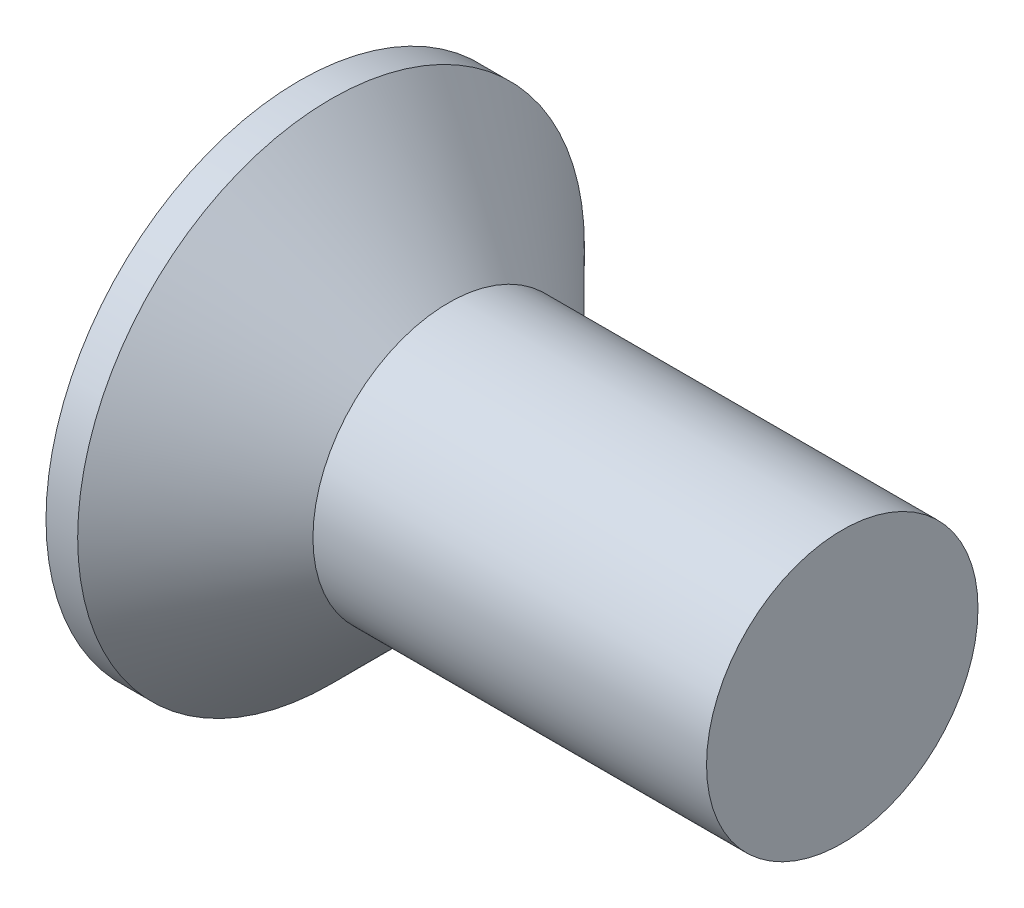
ISO-10303-21;
HEADER;
FILE_DESCRIPTION(('STEP AP214'),'2;1');
FILE_NAME('part.step','',(''),(''),'','','');
FILE_SCHEMA(('AUTOMOTIVE_DESIGN { 1 0 10303 214 1 1 1 1 }'));
ENDSEC;
DATA;
#1=APPLICATION_CONTEXT('core data for automotive mechanical design processes');
#2=APPLICATION_PROTOCOL_DEFINITION('international standard','automotive_design',2000,#1);
#3=PRODUCT_CONTEXT('',#1,'mechanical');
#4=PRODUCT('Part','Part','',(#3));
#5=PRODUCT_RELATED_PRODUCT_CATEGORY('part','',(#4));
#6=PRODUCT_DEFINITION_FORMATION('','',#4);
#7=PRODUCT_DEFINITION_CONTEXT('part definition',#1,'design');
#8=PRODUCT_DEFINITION('design','',#6,#7);
#9=PRODUCT_DEFINITION_SHAPE('','',#8);
#10=(LENGTH_UNIT() NAMED_UNIT(*) SI_UNIT(.MILLI.,.METRE.));
#11=(NAMED_UNIT(*) PLANE_ANGLE_UNIT() SI_UNIT($,.RADIAN.));
#12=(NAMED_UNIT(*) SI_UNIT($,.STERADIAN.) SOLID_ANGLE_UNIT());
#13=UNCERTAINTY_MEASURE_WITH_UNIT(LENGTH_MEASURE(1.E-05),#10,'distance_accuracy_value','');
#14=(GEOMETRIC_REPRESENTATION_CONTEXT(3) GLOBAL_UNCERTAINTY_ASSIGNED_CONTEXT((#13)) GLOBAL_UNIT_ASSIGNED_CONTEXT((#10,
#11,#12)) REPRESENTATION_CONTEXT('',''));
#15=CARTESIAN_POINT('',(0.,0.,0.));
#16=DIRECTION('',(0.,0.,1.));
#17=DIRECTION('',(1.,0.,0.));
#18=AXIS2_PLACEMENT_3D('',#15,#16,#17);
#19=CARTESIAN_POINT('',(1.5,-0.652127712987656,0.265));
#20=DIRECTION('',(0.,0.,-1.));
#21=DIRECTION('',(0.,1.,0.));
#22=AXIS2_PLACEMENT_3D('',#19,#20,#21);
#23=PLANE('',#22);
#24=DIRECTION('',(0.,-1.,0.));
#25=VECTOR('',#24,1.);
#26=CARTESIAN_POINT('',(0.,1.4,0.265));
#27=LINE('',#26,#25);
#28=CARTESIAN_POINT('',(0.,-0.605434455689525,0.265));
#29=VERTEX_POINT('',#28);
#30=CARTESIAN_POINT('',(0.,-1.4,0.265));
#31=VERTEX_POINT('',#30);
#32=EDGE_CURVE('E316',#29,#31,#27,.T.);
#33=ORIENTED_EDGE('',*,*,#32,.F.);
#34=CARTESIAN_POINT('',(-1.0085389410094,-0.681719612968562,0.265));
#35=CARTESIAN_POINT('',(-0.807481462179633,-0.66663360538622,0.265));
#36=CARTESIAN_POINT('',(-0.606428594532586,-0.651485724086024,0.265));
#37=CARTESIAN_POINT('',(-0.204334110292735,-0.621028288165325,0.265));
#38=CARTESIAN_POINT('',(-0.00329249376051076,-0.605718732745374,0.265));
#39=CARTESIAN_POINT('',(0.398775442168543,-0.574900173363986,0.265));
#40=CARTESIAN_POINT('',(0.5998017615675,-0.559391169430348,0.265));
#41=CARTESIAN_POINT('',(1.00183378876656,-0.528117595285747,0.265));
#42=CARTESIAN_POINT('',(1.20283949664117,-0.51235302603386,0.265));
#43=CARTESIAN_POINT('',(1.64887889323337,-0.476997602406684,0.265));
#44=CARTESIAN_POINT('',(1.89390614975171,-0.457325444499711,0.265));
#45=CARTESIAN_POINT('',(2.38390087730606,-0.417264141827879,0.265));
#46=CARTESIAN_POINT('',(2.62886834872376,-0.396875001767827,0.265));
#47=CARTESIAN_POINT('',(2.99625178662767,-0.365441585337288,0.265));
#48=CARTESIAN_POINT('',(3.11870400992563,-0.354821948118252,0.265));
#49=CARTESIAN_POINT('',(3.36357486597481,-0.333207235152481,0.265));
#50=CARTESIAN_POINT('',(3.48599349885817,-0.322212160904486,0.265));
#51=CARTESIAN_POINT('',(3.7307890423533,-0.299726512062336,0.265));
#52=CARTESIAN_POINT('',(3.853165951749,-0.28823592409419,0.265));
#53=CARTESIAN_POINT('',(4.09784976445415,-0.264517408102018,0.265));
#54=CARTESIAN_POINT('',(4.22015666676846,-0.252289469847188,0.265));
#55=CARTESIAN_POINT('',(4.34241437869354,-0.239571952585111,0.265));
#56=B_SPLINE_CURVE_WITH_KNOTS('',3,(#34,#35,#36,#37,#38,#39,#40,#41,#42,#43,#44,#45,#46,#47,#48,
#49,#50,#51,#52,#53,#54,#55),.UNSPECIFIED.,.F.,.F.,(4,2,2,2,2,2,2,2,2,2,4),(0.,0.60486802029486,
1.20973903294725,1.81460996129402,2.41947862023201,3.15692508762775,3.8943667168334,
4.26310182227784,4.6318354559091,5.00057904795376,5.36932775752814),.UNSPECIFIED.);
#57=CARTESIAN_POINT('',(1.5,-0.488785228909384,0.265));
#58=VERTEX_POINT('',#57);
#59=EDGE_CURVE('E197',#29,#58,#56,.T.);
#60=ORIENTED_EDGE('',*,*,#59,.T.);
#61=DIRECTION('',(0.,-1.,0.));
#62=VECTOR('',#61,1.);
#63=CARTESIAN_POINT('',(1.5,0.652127712987655,0.265));
#64=LINE('',#63,#62);
#65=CARTESIAN_POINT('',(1.5,-0.652127712987656,0.265));
#66=VERTEX_POINT('',#65);
#67=EDGE_CURVE('E340',#58,#66,#64,.T.);
#68=ORIENTED_EDGE('',*,*,#67,.T.);
#69=DIRECTION('',(0.894934391398442,0.446197753347436,0.));
#70=VECTOR('',#69,1.);
#71=CARTESIAN_POINT('',(0.,-1.4,0.265));
#72=LINE('',#71,#70);
#73=EDGE_CURVE('E327',#31,#66,#72,.T.);
#74=ORIENTED_EDGE('',*,*,#73,.F.);
#75=EDGE_LOOP('',(#33,#60,#68,#74));
#76=FACE_BOUND('',#75,.T.);
#77=ADVANCED_FACE('F39',(#76),#23,.T.);
#78=CARTESIAN_POINT('',(1.5,0.652127712987655,0.265));
#79=VERTEX_POINT('',#78);
#80=CARTESIAN_POINT('',(1.5,0.488785228909384,0.265));
#81=VERTEX_POINT('',#80);
#82=EDGE_CURVE('E342',#79,#81,#64,.T.);
#83=ORIENTED_EDGE('',*,*,#82,.T.);
#84=CARTESIAN_POINT('',(-1.0085389410086,0.681719612968503,0.265));
#85=CARTESIAN_POINT('',(-0.807481462178845,0.666633605386161,0.265));
#86=CARTESIAN_POINT('',(-0.606428594531807,0.651485724085966,0.265));
#87=CARTESIAN_POINT('',(-0.204334110291975,0.621028288165267,0.265));
#88=CARTESIAN_POINT('',(-0.00329249375976014,0.605718732745317,0.265));
#89=CARTESIAN_POINT('',(0.398775442169277,0.57490017336393,0.265));
#90=CARTESIAN_POINT('',(0.599801761568228,0.559391169430292,0.265));
#91=CARTESIAN_POINT('',(1.00183378876728,0.528117595285691,0.265));
#92=CARTESIAN_POINT('',(1.20283949664187,0.512353026033804,0.265));
#93=CARTESIAN_POINT('',(1.64887889323407,0.476997602406628,0.265));
#94=CARTESIAN_POINT('',(1.89390614975241,0.457325444499654,0.265));
#95=CARTESIAN_POINT('',(2.38390087730677,0.417264141827821,0.265));
#96=CARTESIAN_POINT('',(2.62886834872446,0.396875001767768,0.265));
#97=CARTESIAN_POINT('',(2.99625178662838,0.365441585337227,0.265));
#98=CARTESIAN_POINT('',(3.11870400992634,0.35482194811819,0.265));
#99=CARTESIAN_POINT('',(3.36357486597552,0.333207235152419,0.265));
#100=CARTESIAN_POINT('',(3.48599349885887,0.322212160904423,0.265));
#101=CARTESIAN_POINT('',(3.73078904235401,0.299726512062271,0.265));
#102=CARTESIAN_POINT('',(3.85316595174971,0.288235924094124,0.265));
#103=CARTESIAN_POINT('',(4.09784976445485,0.264517408101949,0.265));
#104=CARTESIAN_POINT('',(4.22015666676916,0.252289469847117,0.265));
#105=CARTESIAN_POINT('',(4.34241437869424,0.239571952585038,0.265));
#106=B_SPLINE_CURVE_WITH_KNOTS('',3,(#84,#85,#86,#87,#88,#89,#90,#91,#92,#93,#94,#95,#96,#97,
#98,#99,#100,#101,#102,#103,#104,#105),.UNSPECIFIED.,.F.,.F.,(4,2,2,2,2,2,2,2,2,2,4),(0.,
0.604868020294833,1.20973903294719,1.81460996129394,2.41947862023192,3.15692508762765,
3.89436671683331,4.26310182227775,4.63183545590901,5.00057904795366,5.36932775752805),.UNSPECIFIED.);
#107=CARTESIAN_POINT('',(0.,0.605434455689525,0.265));
#108=VERTEX_POINT('',#107);
#109=EDGE_CURVE('E190',#81,#108,#106,.F.);
#110=ORIENTED_EDGE('',*,*,#109,.T.);
#111=CARTESIAN_POINT('',(0.,1.4,0.265));
#112=VERTEX_POINT('',#111);
#113=EDGE_CURVE('E318',#112,#108,#27,.T.);
#114=ORIENTED_EDGE('',*,*,#113,.F.);
#115=DIRECTION('',(0.894934391398442,-0.446197753347436,0.));
#116=VECTOR('',#115,1.);
#117=CARTESIAN_POINT('',(0.,1.4,0.265));
#118=LINE('',#117,#116);
#119=EDGE_CURVE('E68',#112,#79,#118,.T.);
#120=ORIENTED_EDGE('',*,*,#119,.T.);
#121=EDGE_LOOP('',(#83,#110,#114,#120));
#122=FACE_BOUND('',#121,.T.);
#123=ADVANCED_FACE('F172',(#122),#23,.T.);
#124=CARTESIAN_POINT('',(1.5,0.652127712987656,-0.265));
#125=DIRECTION('',(0.,0.,1.));
#126=DIRECTION('',(1.,0.,0.));
#127=AXIS2_PLACEMENT_3D('',#124,#125,#126);
#128=PLANE('',#127);
#129=DIRECTION('',(0.,1.,0.));
#130=VECTOR('',#129,1.);
#131=CARTESIAN_POINT('',(1.5,-0.652127712987656,-0.265));
#132=LINE('',#131,#130);
#133=CARTESIAN_POINT('',(1.5,-0.652127712987656,-0.265));
#134=VERTEX_POINT('',#133);
#135=CARTESIAN_POINT('',(1.5,-0.488785228909384,-0.265));
#136=VERTEX_POINT('',#135);
#137=EDGE_CURVE('E341',#134,#136,#132,.T.);
#138=ORIENTED_EDGE('',*,*,#137,.T.);
#139=CARTESIAN_POINT('',(-1.0085389410094,-0.681719612968563,-0.264999999999999));
#140=CARTESIAN_POINT('',(-0.807481462179632,-0.66663360538622,-0.264999999999999));
#141=CARTESIAN_POINT('',(-0.606428594532585,-0.651485724086025,-0.264999999999999));
#142=CARTESIAN_POINT('',(-0.204334110292734,-0.621028288165326,-0.264999999999999));
#143=CARTESIAN_POINT('',(-0.00329249376051024,-0.605718732745375,-0.264999999999999));
#144=CARTESIAN_POINT('',(0.398775442168543,-0.574900173363986,-0.265));
#145=CARTESIAN_POINT('',(0.5998017615675,-0.559391169430348,-0.265));
#146=CARTESIAN_POINT('',(1.00183378876656,-0.528117595285747,-0.265));
#147=CARTESIAN_POINT('',(1.20283949664117,-0.51235302603386,-0.265));
#148=CARTESIAN_POINT('',(1.64887889323337,-0.476997602406684,-0.265));
#149=CARTESIAN_POINT('',(1.89390614975171,-0.457325444499711,-0.265));
#150=CARTESIAN_POINT('',(2.38390087730607,-0.417264141827879,-0.265));
#151=CARTESIAN_POINT('',(2.62886834872376,-0.396875001767827,-0.265000000000001));
#152=CARTESIAN_POINT('',(2.99625178662767,-0.365441585337288,-0.265000000000001));
#153=CARTESIAN_POINT('',(3.11870400992563,-0.354821948118251,-0.265000000000001));
#154=CARTESIAN_POINT('',(3.36357486597482,-0.33320723515248,-0.265000000000001));
#155=CARTESIAN_POINT('',(3.48599349885817,-0.322212160904486,-0.265000000000001));
#156=CARTESIAN_POINT('',(3.73078904235331,-0.299726512062335,-0.265000000000001));
#157=CARTESIAN_POINT('',(3.85316595174901,-0.288235924094189,-0.265000000000001));
#158=CARTESIAN_POINT('',(4.09784976445415,-0.264517408102017,-0.265000000000001));
#159=CARTESIAN_POINT('',(4.22015666676846,-0.252289469847186,-0.265000000000001));
#160=CARTESIAN_POINT('',(4.34241437869354,-0.23957195258511,-0.265000000000001));
#161=B_SPLINE_CURVE_WITH_KNOTS('',3,(#139,#140,#141,#142,#143,#144,#145,#146,#147,#148,#149,
#150,#151,#152,#153,#154,#155,#156,#157,#158,#159,#160),.UNSPECIFIED.,.F.,.F.,(4,2,2,2,2,2,2,2,
2,2,4),(0.,0.604868020294861,1.20973903294725,1.81460996129402,2.41947862023201,
3.15692508762775,3.8943667168334,4.26310182227785,4.6318354559091,5.00057904795376,
5.36932775752814),.UNSPECIFIED.);
#162=CARTESIAN_POINT('',(0.,-0.605434455689525,-0.264999999999999));
#163=VERTEX_POINT('',#162);
#164=EDGE_CURVE('E243',#136,#163,#161,.F.);
#165=ORIENTED_EDGE('',*,*,#164,.T.);
#166=DIRECTION('',(0.,1.,0.));
#167=VECTOR('',#166,1.);
#168=CARTESIAN_POINT('',(0.,-1.4,-0.264999999999999));
#169=LINE('',#168,#167);
#170=CARTESIAN_POINT('',(0.,-1.4,-0.264999999999999));
#171=VERTEX_POINT('',#170);
#172=EDGE_CURVE('E317',#171,#163,#169,.T.);
#173=ORIENTED_EDGE('',*,*,#172,.F.);
#174=DIRECTION('',(0.894934391398442,0.446197753347436,0.));
#175=VECTOR('',#174,1.);
#176=CARTESIAN_POINT('',(0.,-1.4,-0.264999999999999));
#177=LINE('',#176,#175);
#178=EDGE_CURVE('E330',#171,#134,#177,.T.);
#179=ORIENTED_EDGE('',*,*,#178,.T.);
#180=EDGE_LOOP('',(#138,#165,#173,#179));
#181=FACE_BOUND('',#180,.T.);
#182=ADVANCED_FACE('F178',(#181),#128,.T.);
#183=CARTESIAN_POINT('',(0.,0.605434455689525,-0.264999999999999));
#184=VERTEX_POINT('',#183);
#185=CARTESIAN_POINT('',(0.,1.4,-0.264999999999999));
#186=VERTEX_POINT('',#185);
#187=EDGE_CURVE('E326',#184,#186,#169,.T.);
#188=ORIENTED_EDGE('',*,*,#187,.F.);
#189=CARTESIAN_POINT('',(-1.0085389410094,0.681719612968563,-0.264999999999999));
#190=CARTESIAN_POINT('',(-0.807481462179632,0.66663360538622,-0.264999999999999));
#191=CARTESIAN_POINT('',(-0.606428594532585,0.651485724086025,-0.264999999999999));
#192=CARTESIAN_POINT('',(-0.204334110292734,0.621028288165326,-0.264999999999999));
#193=CARTESIAN_POINT('',(-0.00329249376051024,0.605718732745375,-0.264999999999999));
#194=CARTESIAN_POINT('',(0.398775442168543,0.574900173363986,-0.265));
#195=CARTESIAN_POINT('',(0.5998017615675,0.559391169430348,-0.265));
#196=CARTESIAN_POINT('',(1.00183378876656,0.528117595285747,-0.265));
#197=CARTESIAN_POINT('',(1.20283949664117,0.51235302603386,-0.265));
#198=CARTESIAN_POINT('',(1.64887889323337,0.476997602406684,-0.265));
#199=CARTESIAN_POINT('',(1.89390614975171,0.457325444499711,-0.265));
#200=CARTESIAN_POINT('',(2.38390087730607,0.417264141827879,-0.265));
#201=CARTESIAN_POINT('',(2.62886834872376,0.396875001767827,-0.265000000000001));
#202=CARTESIAN_POINT('',(2.99625178662767,0.365441585337288,-0.265000000000001));
#203=CARTESIAN_POINT('',(3.11870400992563,0.354821948118251,-0.265000000000001));
#204=CARTESIAN_POINT('',(3.36357486597482,0.333207235152481,-0.265000000000001));
#205=CARTESIAN_POINT('',(3.48599349885817,0.322212160904486,-0.265000000000001));
#206=CARTESIAN_POINT('',(3.7307890423533,0.299726512062336,-0.265000000000001));
#207=CARTESIAN_POINT('',(3.85316595174901,0.288235924094189,-0.265000000000001));
#208=CARTESIAN_POINT('',(4.09784976445415,0.264517408102017,-0.265000000000001));
#209=CARTESIAN_POINT('',(4.22015666676846,0.252289469847187,-0.265000000000001));
#210=CARTESIAN_POINT('',(4.34241437869354,0.23957195258511,-0.265000000000001));
#211=B_SPLINE_CURVE_WITH_KNOTS('',3,(#189,#190,#191,#192,#193,#194,#195,#196,#197,#198,#199,
#200,#201,#202,#203,#204,#205,#206,#207,#208,#209,#210),.UNSPECIFIED.,.F.,.F.,(4,2,2,2,2,2,2,2,
2,2,4),(0.,0.604868020294861,1.20973903294725,1.81460996129402,2.41947862023201,
3.15692508762775,3.8943667168334,4.26310182227785,4.6318354559091,5.00057904795376,
5.36932775752814),.UNSPECIFIED.);
#212=CARTESIAN_POINT('',(1.5,0.488785228909384,-0.265));
#213=VERTEX_POINT('',#212);
#214=EDGE_CURVE('E238',#184,#213,#211,.T.);
#215=ORIENTED_EDGE('',*,*,#214,.T.);
#216=CARTESIAN_POINT('',(1.5,0.652127712987656,-0.265));
#217=VERTEX_POINT('',#216);
#218=EDGE_CURVE('E347',#213,#217,#132,.T.);
#219=ORIENTED_EDGE('',*,*,#218,.T.);
#220=DIRECTION('',(0.894934391398442,-0.446197753347436,0.));
#221=VECTOR('',#220,1.);
#222=CARTESIAN_POINT('',(0.,1.4,-0.264999999999999));
#223=LINE('',#222,#221);
#224=EDGE_CURVE('E334',#186,#217,#223,.T.);
#225=ORIENTED_EDGE('',*,*,#224,.F.);
#226=EDGE_LOOP('',(#188,#215,#219,#225));
#227=FACE_BOUND('',#226,.T.);
#228=ADVANCED_FACE('F404',(#227),#128,.T.);
#229=CARTESIAN_POINT('',(1.5,-0.652127712987656,-0.265));
#230=DIRECTION('',(-1.,0.,0.));
#231=DIRECTION('',(0.,0.,1.));
#232=AXIS2_PLACEMENT_3D('',#229,#230,#231);
#233=PLANE('',#232);
#234=ORIENTED_EDGE('',*,*,#67,.F.);
#235=CARTESIAN_POINT('',(1.5,0.,0.));
#236=DIRECTION('',(-1.,0.,0.));
#237=DIRECTION('',(0.,0.,1.));
#238=AXIS2_PLACEMENT_3D('',#235,#236,#237);
#239=CIRCLE('',#238,0.555999999999999);
#240=EDGE_CURVE('E287',#136,#58,#239,.T.);
#241=ORIENTED_EDGE('',*,*,#240,.F.);
#242=ORIENTED_EDGE('',*,*,#137,.F.);
#243=DIRECTION('',(0.,0.,-1.));
#244=VECTOR('',#243,1.);
#245=CARTESIAN_POINT('',(1.5,-0.652127712987656,0.265));
#246=LINE('',#245,#244);
#247=EDGE_CURVE('E337',#66,#134,#246,.T.);
#248=ORIENTED_EDGE('',*,*,#247,.F.);
#249=EDGE_LOOP('',(#234,#241,#242,#248));
#250=FACE_BOUND('',#249,.T.);
#251=ADVANCED_FACE('F383',(#250),#233,.T.);
#252=DIRECTION('',(0.,0.,-1.));
#253=VECTOR('',#252,1.);
#254=CARTESIAN_POINT('',(1.5,-0.265000000000002,0.652127712987654));
#255=LINE('',#254,#253);
#256=CARTESIAN_POINT('',(1.5,-0.264999999999998,-0.488785228909385));
#257=VERTEX_POINT('',#256);
#258=CARTESIAN_POINT('',(1.5,-0.264999999999998,-0.652127712987657));
#259=VERTEX_POINT('',#258);
#260=EDGE_CURVE('E302',#257,#259,#255,.T.);
#261=ORIENTED_EDGE('',*,*,#260,.F.);
#262=CARTESIAN_POINT('',(1.5,0.265000000000002,-0.488785228909383));
#263=VERTEX_POINT('',#262);
#264=EDGE_CURVE('E292',#263,#257,#239,.T.);
#265=ORIENTED_EDGE('',*,*,#264,.F.);
#266=DIRECTION('',(0.,0.,1.));
#267=VECTOR('',#266,1.);
#268=CARTESIAN_POINT('',(1.5,0.265000000000002,-0.652127712987655));
#269=LINE('',#268,#267);
#270=CARTESIAN_POINT('',(1.5,0.265000000000002,-0.652127712987655));
#271=VERTEX_POINT('',#270);
#272=EDGE_CURVE('E300',#271,#263,#269,.T.);
#273=ORIENTED_EDGE('',*,*,#272,.F.);
#274=DIRECTION('',(0.,1.,0.));
#275=VECTOR('',#274,1.);
#276=CARTESIAN_POINT('',(1.5,-0.264999999999998,-0.652127712987657));
#277=LINE('',#276,#275);
#278=EDGE_CURVE('E311',#259,#271,#277,.T.);
#279=ORIENTED_EDGE('',*,*,#278,.F.);
#280=EDGE_LOOP('',(#261,#265,#273,#279));
#281=FACE_BOUND('',#280,.T.);
#282=ADVANCED_FACE('F298',(#281),#233,.T.);
#283=ORIENTED_EDGE('',*,*,#218,.F.);
#284=EDGE_CURVE('E279',#81,#213,#239,.T.);
#285=ORIENTED_EDGE('',*,*,#284,.F.);
#286=ORIENTED_EDGE('',*,*,#82,.F.);
#287=DIRECTION('',(0.,0.,1.));
#288=VECTOR('',#287,1.);
#289=CARTESIAN_POINT('',(1.5,0.652127712987656,-0.265));
#290=LINE('',#289,#288);
#291=EDGE_CURVE('E338',#217,#79,#290,.T.);
#292=ORIENTED_EDGE('',*,*,#291,.F.);
#293=EDGE_LOOP('',(#283,#285,#286,#292));
#294=FACE_BOUND('',#293,.T.);
#295=ADVANCED_FACE('F384',(#294),#233,.T.);
#296=CARTESIAN_POINT('',(1.5,-0.264999999999998,-0.652127712987657));
#297=DIRECTION('',(0.,1.,0.));
#298=DIRECTION('',(0.,0.,1.));
#299=AXIS2_PLACEMENT_3D('',#296,#297,#298);
#300=PLANE('',#299);
#301=DIRECTION('',(0.,0.,-1.));
#302=VECTOR('',#301,1.);
#303=CARTESIAN_POINT('',(0.,-0.265000000000005,1.4));
#304=LINE('',#303,#302);
#305=CARTESIAN_POINT('',(0.,-0.264999999999998,-0.605434455689526));
#306=VERTEX_POINT('',#305);
#307=CARTESIAN_POINT('',(0.,-0.264999999999995,-1.4));
#308=VERTEX_POINT('',#307);
#309=EDGE_CURVE('E444',#306,#308,#304,.T.);
#310=ORIENTED_EDGE('',*,*,#309,.F.);
#311=CARTESIAN_POINT('',(-1.0085389410094,-0.264999999999998,-0.681719612968563));
#312=CARTESIAN_POINT('',(-0.807481462179632,-0.264999999999998,-0.666633605386221));
#313=CARTESIAN_POINT('',(-0.606428594532586,-0.264999999999998,-0.651485724086025));
#314=CARTESIAN_POINT('',(-0.204334110292734,-0.264999999999998,-0.621028288165326));
#315=CARTESIAN_POINT('',(-0.00329249376051043,-0.264999999999998,-0.605718732745375));
#316=CARTESIAN_POINT('',(0.398775442168543,-0.264999999999998,-0.574900173363987));
#317=CARTESIAN_POINT('',(0.5998017615675,-0.264999999999998,-0.559391169430349));
#318=CARTESIAN_POINT('',(1.00183378876656,-0.264999999999998,-0.528117595285748));
#319=CARTESIAN_POINT('',(1.20283949664117,-0.264999999999998,-0.512353026033861));
#320=CARTESIAN_POINT('',(1.64887889323337,-0.264999999999999,-0.476997602406685));
#321=CARTESIAN_POINT('',(1.89390614975171,-0.264999999999999,-0.457325444499712));
#322=CARTESIAN_POINT('',(2.38390087730607,-0.264999999999999,-0.41726414182788));
#323=CARTESIAN_POINT('',(2.62886834872376,-0.264999999999999,-0.396875001767828));
#324=CARTESIAN_POINT('',(2.99625178662767,-0.264999999999999,-0.365441585337289));
#325=CARTESIAN_POINT('',(3.11870400992563,-0.264999999999999,-0.354821948118252));
#326=CARTESIAN_POINT('',(3.36357486597482,-0.264999999999999,-0.333207235152482));
#327=CARTESIAN_POINT('',(3.48599349885817,-0.264999999999999,-0.322212160904487));
#328=CARTESIAN_POINT('',(3.73078904235331,-0.264999999999999,-0.299726512062337));
#329=CARTESIAN_POINT('',(3.85316595174901,-0.264999999999999,-0.288235924094191));
#330=CARTESIAN_POINT('',(4.09784976445415,-0.264999999999999,-0.264517408102019));
#331=CARTESIAN_POINT('',(4.22015666676846,-0.264999999999999,-0.252289469847188));
#332=CARTESIAN_POINT('',(4.34241437869354,-0.264999999999999,-0.239571952585112));
#333=B_SPLINE_CURVE_WITH_KNOTS('',3,(#311,#312,#313,#314,#315,#316,#317,#318,#319,#320,#321,
#322,#323,#324,#325,#326,#327,#328,#329,#330,#331,#332),.UNSPECIFIED.,.F.,.F.,(4,2,2,2,2,2,2,2,
2,2,4),(0.,0.604868020294861,1.20973903294725,1.81460996129402,2.41947862023201,
3.15692508762775,3.8943667168334,4.26310182227785,4.6318354559091,5.00057904795376,
5.36932775752814),.UNSPECIFIED.);
#334=EDGE_CURVE('E231',#306,#257,#333,.T.);
#335=ORIENTED_EDGE('',*,*,#334,.T.);
#336=ORIENTED_EDGE('',*,*,#260,.T.);
#337=DIRECTION('',(0.894934391398442,0.,0.446197753347436));
#338=VECTOR('',#337,1.);
#339=CARTESIAN_POINT('',(0.,-0.264999999999995,-1.4));
#340=LINE('',#339,#338);
#341=EDGE_CURVE('E427',#308,#259,#340,.T.);
#342=ORIENTED_EDGE('',*,*,#341,.F.);
#343=EDGE_LOOP('',(#310,#335,#336,#342));
#344=FACE_BOUND('',#343,.T.);
#345=ADVANCED_FACE('F440',(#344),#300,.T.);
#346=CARTESIAN_POINT('',(1.5,0.264999999999998,0.652127712987657));
#347=DIRECTION('',(0.,-1.,0.));
#348=DIRECTION('',(1.,0.,0.));
#349=AXIS2_PLACEMENT_3D('',#346,#347,#348);
#350=PLANE('',#349);
#351=ORIENTED_EDGE('',*,*,#272,.T.);
#352=CARTESIAN_POINT('',(-1.0085389410094,0.265000000000001,-0.681719612968562));
#353=CARTESIAN_POINT('',(-0.807481462179632,0.265000000000001,-0.66663360538622));
#354=CARTESIAN_POINT('',(-0.606428594532586,0.265000000000001,-0.651485724086024));
#355=CARTESIAN_POINT('',(-0.204334110292734,0.265000000000002,-0.621028288165325));
#356=CARTESIAN_POINT('',(-0.00329249376051035,0.265000000000002,-0.605718732745374));
#357=CARTESIAN_POINT('',(0.398775442168543,0.265000000000002,-0.574900173363986));
#358=CARTESIAN_POINT('',(0.5998017615675,0.265000000000002,-0.559391169430347));
#359=CARTESIAN_POINT('',(1.00183378876656,0.265000000000002,-0.528117595285746));
#360=CARTESIAN_POINT('',(1.20283949664117,0.265000000000002,-0.512353026033859));
#361=CARTESIAN_POINT('',(1.64887889323337,0.265000000000002,-0.476997602406683));
#362=CARTESIAN_POINT('',(1.89390614975171,0.265000000000002,-0.45732544449971));
#363=CARTESIAN_POINT('',(2.38390087730606,0.265000000000002,-0.417264141827878));
#364=CARTESIAN_POINT('',(2.62886834872376,0.265000000000002,-0.396875001767826));
#365=CARTESIAN_POINT('',(2.99625178662767,0.265000000000002,-0.365441585337287));
#366=CARTESIAN_POINT('',(3.11870400992563,0.265000000000002,-0.35482194811825));
#367=CARTESIAN_POINT('',(3.36357486597482,0.265000000000002,-0.33320723515248));
#368=CARTESIAN_POINT('',(3.48599349885817,0.265000000000002,-0.322212160904485));
#369=CARTESIAN_POINT('',(3.7307890423533,0.265000000000002,-0.299726512062335));
#370=CARTESIAN_POINT('',(3.85316595174901,0.265000000000002,-0.288235924094188));
#371=CARTESIAN_POINT('',(4.09784976445415,0.265000000000002,-0.264517408102016));
#372=CARTESIAN_POINT('',(4.22015666676846,0.265000000000002,-0.252289469847186));
#373=CARTESIAN_POINT('',(4.34241437869354,0.265000000000002,-0.239571952585109));
#374=B_SPLINE_CURVE_WITH_KNOTS('',3,(#352,#353,#354,#355,#356,#357,#358,#359,#360,#361,#362,
#363,#364,#365,#366,#367,#368,#369,#370,#371,#372,#373),.UNSPECIFIED.,.F.,.F.,(4,2,2,2,2,2,2,2,
2,2,4),(0.,0.604868020294861,1.20973903294725,1.81460996129402,2.41947862023201,
3.15692508762775,3.8943667168334,4.26310182227785,4.6318354559091,5.00057904795376,
5.36932775752814),.UNSPECIFIED.);
#375=CARTESIAN_POINT('',(0.,0.265000000000002,-0.605434455689524));
#376=VERTEX_POINT('',#375);
#377=EDGE_CURVE('E224',#263,#376,#374,.F.);
#378=ORIENTED_EDGE('',*,*,#377,.T.);
#379=DIRECTION('',(0.,0.,1.));
#380=VECTOR('',#379,1.);
#381=CARTESIAN_POINT('',(0.,0.265000000000004,-1.4));
#382=LINE('',#381,#380);
#383=CARTESIAN_POINT('',(0.,0.265000000000004,-1.4));
#384=VERTEX_POINT('',#383);
#385=EDGE_CURVE('E426',#384,#376,#382,.T.);
#386=ORIENTED_EDGE('',*,*,#385,.F.);
#387=DIRECTION('',(0.894934391398442,0.,0.446197753347436));
#388=VECTOR('',#387,1.);
#389=CARTESIAN_POINT('',(0.,0.265000000000004,-1.4));
#390=LINE('',#389,#388);
#391=EDGE_CURVE('E304',#384,#271,#390,.T.);
#392=ORIENTED_EDGE('',*,*,#391,.T.);
#393=EDGE_LOOP('',(#351,#378,#386,#392));
#394=FACE_BOUND('',#393,.T.);
#395=ADVANCED_FACE('F303',(#394),#350,.T.);
#396=CARTESIAN_POINT('',(1.5,-0.265000000000002,0.652127712987654));
#397=VERTEX_POINT('',#396);
#398=CARTESIAN_POINT('',(1.5,-0.265000000000002,0.488785228909383));
#399=VERTEX_POINT('',#398);
#400=EDGE_CURVE('E437',#397,#399,#255,.T.);
#401=ORIENTED_EDGE('',*,*,#400,.T.);
#402=CARTESIAN_POINT('',(-1.0085389410086,-0.265000000000002,0.681719612968502));
#403=CARTESIAN_POINT('',(-0.807481462178846,-0.265000000000002,0.66663360538616));
#404=CARTESIAN_POINT('',(-0.606428594531808,-0.265000000000002,0.651485724085965));
#405=CARTESIAN_POINT('',(-0.204334110291975,-0.265000000000002,0.621028288165267));
#406=CARTESIAN_POINT('',(-0.00329249375976035,-0.265000000000002,0.605718732745316));
#407=CARTESIAN_POINT('',(0.398775442169277,-0.265000000000002,0.574900173363929));
#408=CARTESIAN_POINT('',(0.599801761568227,-0.265000000000002,0.559391169430291));
#409=CARTESIAN_POINT('',(1.00183378876728,-0.265000000000002,0.52811759528569));
#410=CARTESIAN_POINT('',(1.20283949664187,-0.265000000000002,0.512353026033803));
#411=CARTESIAN_POINT('',(1.64887889323407,-0.265000000000002,0.476997602406627));
#412=CARTESIAN_POINT('',(1.89390614975241,-0.265000000000002,0.457325444499653));
#413=CARTESIAN_POINT('',(2.38390087730677,-0.265000000000002,0.41726414182782));
#414=CARTESIAN_POINT('',(2.62886834872446,-0.265000000000002,0.396875001767767));
#415=CARTESIAN_POINT('',(2.99625178662838,-0.265000000000001,0.365441585337227));
#416=CARTESIAN_POINT('',(3.11870400992634,-0.265000000000001,0.35482194811819));
#417=CARTESIAN_POINT('',(3.36357486597552,-0.265000000000001,0.333207235152418));
#418=CARTESIAN_POINT('',(3.48599349885887,-0.265000000000001,0.322212160904422));
#419=CARTESIAN_POINT('',(3.73078904235401,-0.265000000000001,0.29972651206227));
#420=CARTESIAN_POINT('',(3.85316595174971,-0.265000000000001,0.288235924094123));
#421=CARTESIAN_POINT('',(4.09784976445485,-0.265000000000001,0.264517408101948));
#422=CARTESIAN_POINT('',(4.22015666676916,-0.265000000000001,0.252289469847116));
#423=CARTESIAN_POINT('',(4.34241437869424,-0.265000000000001,0.239571952585037));
#424=B_SPLINE_CURVE_WITH_KNOTS('',3,(#402,#403,#404,#405,#406,#407,#408,#409,#410,#411,#412,
#413,#414,#415,#416,#417,#418,#419,#420,#421,#422,#423),.UNSPECIFIED.,.F.,.F.,(4,2,2,2,2,2,2,2,
2,2,4),(0.,0.604868020294834,1.20973903294719,1.81460996129394,2.41947862023192,
3.15692508762765,3.89436671683331,4.26310182227775,4.63183545590901,5.00057904795366,
5.36932775752804),.UNSPECIFIED.);
#425=CARTESIAN_POINT('',(0.,-0.265000000000002,0.605434455689524));
#426=VERTEX_POINT('',#425);
#427=EDGE_CURVE('E216',#399,#426,#424,.F.);
#428=ORIENTED_EDGE('',*,*,#427,.T.);
#429=CARTESIAN_POINT('',(0.,-0.265000000000005,1.4));
#430=VERTEX_POINT('',#429);
#431=EDGE_CURVE('E443',#430,#426,#304,.T.);
#432=ORIENTED_EDGE('',*,*,#431,.F.);
#433=DIRECTION('',(0.894934391398442,0.,-0.446197753347436));
#434=VECTOR('',#433,1.);
#435=CARTESIAN_POINT('',(0.,-0.265000000000005,1.4));
#436=LINE('',#435,#434);
#437=EDGE_CURVE('E435',#430,#397,#436,.T.);
#438=ORIENTED_EDGE('',*,*,#437,.T.);
#439=EDGE_LOOP('',(#401,#428,#432,#438));
#440=FACE_BOUND('',#439,.T.);
#441=ADVANCED_FACE('F448',(#440),#300,.T.);
#442=CARTESIAN_POINT('',(0.,0.264999999999997,0.605434455689526));
#443=VERTEX_POINT('',#442);
#444=CARTESIAN_POINT('',(0.,0.264999999999995,1.4));
#445=VERTEX_POINT('',#444);
#446=EDGE_CURVE('E419',#443,#445,#382,.T.);
#447=ORIENTED_EDGE('',*,*,#446,.F.);
#448=CARTESIAN_POINT('',(-1.0085389410094,0.264999999999997,0.681719612968564));
#449=CARTESIAN_POINT('',(-0.807481462179632,0.264999999999997,0.666633605386221));
#450=CARTESIAN_POINT('',(-0.606428594532585,0.264999999999997,0.651485724086026));
#451=CARTESIAN_POINT('',(-0.204334110292734,0.264999999999997,0.621028288165326));
#452=CARTESIAN_POINT('',(-0.00329249376051032,0.264999999999997,0.605718732745376));
#453=CARTESIAN_POINT('',(0.398775442168543,0.264999999999998,0.574900173363987));
#454=CARTESIAN_POINT('',(0.5998017615675,0.264999999999998,0.559391169430349));
#455=CARTESIAN_POINT('',(1.00183378876656,0.264999999999998,0.528117595285748));
#456=CARTESIAN_POINT('',(1.20283949664117,0.264999999999998,0.512353026033861));
#457=CARTESIAN_POINT('',(1.64887889323337,0.264999999999998,0.476997602406685));
#458=CARTESIAN_POINT('',(1.89390614975171,0.264999999999999,0.457325444499712));
#459=CARTESIAN_POINT('',(2.38390087730606,0.264999999999999,0.41726414182788));
#460=CARTESIAN_POINT('',(2.62886834872376,0.264999999999999,0.396875001767828));
#461=CARTESIAN_POINT('',(2.99625178662767,0.264999999999999,0.365441585337288));
#462=CARTESIAN_POINT('',(3.11870400992563,0.265,0.354821948118252));
#463=CARTESIAN_POINT('',(3.36357486597482,0.265,0.333207235152482));
#464=CARTESIAN_POINT('',(3.48599349885817,0.265,0.322212160904487));
#465=CARTESIAN_POINT('',(3.7307890423533,0.265,0.299726512062336));
#466=CARTESIAN_POINT('',(3.85316595174901,0.265,0.28823592409419));
#467=CARTESIAN_POINT('',(4.09784976445415,0.265,0.264517408102018));
#468=CARTESIAN_POINT('',(4.22015666676846,0.265,0.252289469847187));
#469=CARTESIAN_POINT('',(4.34241437869354,0.265,0.239571952585111));
#470=B_SPLINE_CURVE_WITH_KNOTS('',3,(#448,#449,#450,#451,#452,#453,#454,#455,#456,#457,#458,
#459,#460,#461,#462,#463,#464,#465,#466,#467,#468,#469),.UNSPECIFIED.,.F.,.F.,(4,2,2,2,2,2,2,2,
2,2,4),(0.,0.604868020294861,1.20973903294725,1.81460996129402,2.41947862023201,
3.15692508762775,3.8943667168334,4.26310182227785,4.6318354559091,5.00057904795376,
5.36932775752814),.UNSPECIFIED.);
#471=CARTESIAN_POINT('',(1.5,0.264999999999998,0.488785228909386));
#472=VERTEX_POINT('',#471);
#473=EDGE_CURVE('E11',#443,#472,#470,.T.);
#474=ORIENTED_EDGE('',*,*,#473,.T.);
#475=CARTESIAN_POINT('',(1.5,0.264999999999998,0.652127712987657));
#476=VERTEX_POINT('',#475);
#477=EDGE_CURVE('E204',#472,#476,#269,.T.);
#478=ORIENTED_EDGE('',*,*,#477,.T.);
#479=DIRECTION('',(0.894934391398442,0.,-0.446197753347436));
#480=VECTOR('',#479,1.);
#481=CARTESIAN_POINT('',(0.,0.264999999999995,1.4));
#482=LINE('',#481,#480);
#483=EDGE_CURVE('E425',#445,#476,#482,.T.);
#484=ORIENTED_EDGE('',*,*,#483,.F.);
#485=EDGE_LOOP('',(#447,#474,#478,#484));
#486=FACE_BOUND('',#485,.T.);
#487=ADVANCED_FACE('F371',(#486),#350,.T.);
#488=CARTESIAN_POINT('',(0.,0.,0.));
#489=DIRECTION('',(-1.,0.,0.));
#490=DIRECTION('',(0.,0.,1.));
#491=AXIS2_PLACEMENT_3D('',#488,#489,#490);
#492=PLANE('',#491);
#493=CARTESIAN_POINT('',(0.,0.,0.));
#494=DIRECTION('',(-1.,0.,0.));
#495=DIRECTION('',(0.,0.,1.));
#496=AXIS2_PLACEMENT_3D('',#493,#494,#495);
#497=CIRCLE('',#496,2.8);
#498=CARTESIAN_POINT('',(0.,0.,2.8));
#499=VERTEX_POINT('',#498);
#500=EDGE_CURVE('E53',#499,#499,#497,.T.);
#501=ORIENTED_EDGE('',*,*,#500,.T.);
#502=EDGE_LOOP('',(#501));
#503=FACE_BOUND('',#502,.T.);
#504=ORIENTED_EDGE('',*,*,#431,.T.);
#505=CARTESIAN_POINT('',(0.,0.,0.));
#506=DIRECTION('',(-1.,0.,0.));
#507=DIRECTION('',(0.,0.,1.));
#508=AXIS2_PLACEMENT_3D('',#505,#506,#507);
#509=CIRCLE('',#508,0.660890217915253);
#510=EDGE_CURVE('E273',#29,#426,#509,.T.);
#511=ORIENTED_EDGE('',*,*,#510,.F.);
#512=ORIENTED_EDGE('',*,*,#32,.T.);
#513=DIRECTION('',(0.,0.,-1.));
#514=VECTOR('',#513,1.);
#515=CARTESIAN_POINT('',(0.,-1.4,0.265));
#516=LINE('',#515,#514);
#517=EDGE_CURVE('E321',#31,#171,#516,.T.);
#518=ORIENTED_EDGE('',*,*,#517,.T.);
#519=ORIENTED_EDGE('',*,*,#172,.T.);
#520=EDGE_CURVE('E275',#306,#163,#509,.T.);
#521=ORIENTED_EDGE('',*,*,#520,.F.);
#522=ORIENTED_EDGE('',*,*,#309,.T.);
#523=DIRECTION('',(0.,1.,0.));
#524=VECTOR('',#523,1.);
#525=CARTESIAN_POINT('',(0.,-0.264999999999995,-1.4));
#526=LINE('',#525,#524);
#527=EDGE_CURVE('E432',#308,#384,#526,.T.);
#528=ORIENTED_EDGE('',*,*,#527,.T.);
#529=ORIENTED_EDGE('',*,*,#385,.T.);
#530=EDGE_CURVE('E272',#184,#376,#509,.T.);
#531=ORIENTED_EDGE('',*,*,#530,.F.);
#532=ORIENTED_EDGE('',*,*,#187,.T.);
#533=DIRECTION('',(0.,0.,1.));
#534=VECTOR('',#533,1.);
#535=CARTESIAN_POINT('',(0.,1.4,-0.264999999999999));
#536=LINE('',#535,#534);
#537=EDGE_CURVE('E313',#186,#112,#536,.T.);
#538=ORIENTED_EDGE('',*,*,#537,.T.);
#539=ORIENTED_EDGE('',*,*,#113,.T.);
#540=EDGE_CURVE('E268',#443,#108,#509,.T.);
#541=ORIENTED_EDGE('',*,*,#540,.F.);
#542=ORIENTED_EDGE('',*,*,#446,.T.);
#543=DIRECTION('',(0.,-1.,0.));
#544=VECTOR('',#543,1.);
#545=CARTESIAN_POINT('',(0.,0.264999999999995,1.4));
#546=LINE('',#545,#544);
#547=EDGE_CURVE('E205',#445,#430,#546,.T.);
#548=ORIENTED_EDGE('',*,*,#547,.T.);
#549=EDGE_LOOP('',(#504,#511,#512,#518,#519,#521,#522,#528,#529,#531,#532,#538,#539,#541,#542,#548));
#550=FACE_BOUND('',#549,.T.);
#551=ADVANCED_FACE('F41',(#503,#550),#492,.T.);
#552=CARTESIAN_POINT('',(-6.34999999999999,0.,0.));
#553=DIRECTION('',(-1.,0.,0.));
#554=DIRECTION('',(0.,0.,1.));
#555=AXIS2_PLACEMENT_3D('',#552,#553,#554);
#556=CYLINDRICAL_SURFACE('',#555,2.8);
#557=CARTESIAN_POINT('',(0.350000000000004,0.,0.));
#558=DIRECTION('',(-1.,0.,0.));
#559=DIRECTION('',(0.,0.,1.));
#560=AXIS2_PLACEMENT_3D('',#557,#558,#559);
#561=CIRCLE('',#560,2.8);
#562=CARTESIAN_POINT('',(0.350000000000004,0.,2.8));
#563=VERTEX_POINT('',#562);
#564=EDGE_CURVE('E353',#563,#563,#561,.T.);
#565=ORIENTED_EDGE('',*,*,#564,.T.);
#566=EDGE_LOOP('',(#565));
#567=FACE_BOUND('',#566,.T.);
#568=ORIENTED_EDGE('',*,*,#500,.F.);
#569=EDGE_LOOP('',(#568));
#570=FACE_BOUND('',#569,.T.);
#571=ADVANCED_FACE('F360',(#567,#570),#556,.T.);
#572=CARTESIAN_POINT('',(0.350000000000004,0.,0.));
#573=DIRECTION('',(-1.,0.,0.));
#574=DIRECTION('',(0.,0.,1.));
#575=AXIS2_PLACEMENT_3D('',#572,#573,#574);
#576=CONICAL_SURFACE('',#575,2.8,0.78539816339745);
#577=CARTESIAN_POINT('',(1.65,0.,0.));
#578=DIRECTION('',(-1.,0.,0.));
#579=DIRECTION('',(0.,0.,1.));
#580=AXIS2_PLACEMENT_3D('',#577,#578,#579);
#581=CIRCLE('',#580,1.5);
#582=CARTESIAN_POINT('',(1.65,0.,1.5));
#583=VERTEX_POINT('',#582);
#584=EDGE_CURVE('E350',#583,#583,#581,.T.);
#585=ORIENTED_EDGE('',*,*,#584,.T.);
#586=EDGE_LOOP('',(#585));
#587=FACE_BOUND('',#586,.T.);
#588=ORIENTED_EDGE('',*,*,#564,.F.);
#589=EDGE_LOOP('',(#588));
#590=FACE_BOUND('',#589,.T.);
#591=ADVANCED_FACE('F362',(#587,#590),#576,.T.);
#592=CARTESIAN_POINT('',(-6.34999999999999,0.,0.));
#593=DIRECTION('',(-1.,0.,0.));
#594=DIRECTION('',(0.,0.,1.));
#595=AXIS2_PLACEMENT_3D('',#592,#593,#594);
#596=CYLINDRICAL_SURFACE('',#595,1.5);
#597=CARTESIAN_POINT('',(6.,0.,0.));
#598=DIRECTION('',(-1.,0.,0.));
#599=DIRECTION('',(0.,0.,1.));
#600=AXIS2_PLACEMENT_3D('',#597,#598,#599);
#601=CIRCLE('',#600,1.5);
#602=CARTESIAN_POINT('',(6.,0.,1.5));
#603=VERTEX_POINT('',#602);
#604=EDGE_CURVE('E324',#603,#603,#601,.T.);
#605=ORIENTED_EDGE('',*,*,#604,.T.);
#606=EDGE_LOOP('',(#605));
#607=FACE_BOUND('',#606,.T.);
#608=ORIENTED_EDGE('',*,*,#584,.F.);
#609=EDGE_LOOP('',(#608));
#610=FACE_BOUND('',#609,.T.);
#611=ADVANCED_FACE('F368',(#607,#610),#596,.T.);
#612=CARTESIAN_POINT('',(6.,1.5,0.));
#613=DIRECTION('',(1.,0.,0.));
#614=DIRECTION('',(0.,0.,-1.));
#615=AXIS2_PLACEMENT_3D('',#612,#613,#614);
#616=PLANE('',#615);
#617=ORIENTED_EDGE('',*,*,#604,.F.);
#618=EDGE_LOOP('',(#617));
#619=FACE_BOUND('',#618,.T.);
#620=ADVANCED_FACE('F375',(#619),#616,.T.);
#621=ORIENTED_EDGE('',*,*,#477,.F.);
#622=EDGE_CURVE('E280',#399,#472,#239,.T.);
#623=ORIENTED_EDGE('',*,*,#622,.F.);
#624=ORIENTED_EDGE('',*,*,#400,.F.);
#625=DIRECTION('',(0.,-1.,0.));
#626=VECTOR('',#625,1.);
#627=CARTESIAN_POINT('',(1.5,0.264999999999998,0.652127712987657));
#628=LINE('',#627,#626);
#629=EDGE_CURVE('E305',#476,#397,#628,.T.);
#630=ORIENTED_EDGE('',*,*,#629,.F.);
#631=EDGE_LOOP('',(#621,#623,#624,#630));
#632=FACE_BOUND('',#631,.T.);
#633=ADVANCED_FACE('F379',(#632),#233,.T.);
#634=CARTESIAN_POINT('',(1.5,-0.652127712987656,-0.265));
#635=DIRECTION('',(-0.446197753347436,0.894934391398443,0.));
#636=DIRECTION('',(-0.894934391398442,-0.446197753347436,0.));
#637=AXIS2_PLACEMENT_3D('',#634,#635,#636);
#638=PLANE('',#637);
#639=ORIENTED_EDGE('',*,*,#178,.F.);
#640=ORIENTED_EDGE('',*,*,#517,.F.);
#641=ORIENTED_EDGE('',*,*,#73,.T.);
#642=ORIENTED_EDGE('',*,*,#247,.T.);
#643=EDGE_LOOP('',(#639,#640,#641,#642));
#644=FACE_BOUND('',#643,.T.);
#645=ADVANCED_FACE('F184',(#644),#638,.T.);
#646=CARTESIAN_POINT('',(0.,1.4,0.265));
#647=DIRECTION('',(-0.446197753347436,-0.894934391398443,0.));
#648=DIRECTION('',(0.894934391398442,-0.446197753347436,0.));
#649=AXIS2_PLACEMENT_3D('',#646,#647,#648);
#650=PLANE('',#649);
#651=ORIENTED_EDGE('',*,*,#119,.F.);
#652=ORIENTED_EDGE('',*,*,#537,.F.);
#653=ORIENTED_EDGE('',*,*,#224,.T.);
#654=ORIENTED_EDGE('',*,*,#291,.T.);
#655=EDGE_LOOP('',(#651,#652,#653,#654));
#656=FACE_BOUND('',#655,.T.);
#657=ADVANCED_FACE('F385',(#656),#650,.T.);
#658=CARTESIAN_POINT('',(1.5,0.265000000000002,-0.652127712987655));
#659=DIRECTION('',(-0.446197753347436,0.,0.894934391398443));
#660=DIRECTION('',(-0.894934391398442,0.,-0.446197753347436));
#661=AXIS2_PLACEMENT_3D('',#658,#659,#660);
#662=PLANE('',#661);
#663=ORIENTED_EDGE('',*,*,#391,.F.);
#664=ORIENTED_EDGE('',*,*,#527,.F.);
#665=ORIENTED_EDGE('',*,*,#341,.T.);
#666=ORIENTED_EDGE('',*,*,#278,.T.);
#667=EDGE_LOOP('',(#663,#664,#665,#666));
#668=FACE_BOUND('',#667,.T.);
#669=ADVANCED_FACE('F209',(#668),#662,.T.);
#670=CARTESIAN_POINT('',(0.,-0.265000000000005,1.4));
#671=DIRECTION('',(-0.446197753347436,0.,-0.894934391398443));
#672=DIRECTION('',(0.894934391398442,0.,-0.446197753347436));
#673=AXIS2_PLACEMENT_3D('',#670,#671,#672);
#674=PLANE('',#673);
#675=ORIENTED_EDGE('',*,*,#437,.F.);
#676=ORIENTED_EDGE('',*,*,#547,.F.);
#677=ORIENTED_EDGE('',*,*,#483,.T.);
#678=ORIENTED_EDGE('',*,*,#629,.T.);
#679=EDGE_LOOP('',(#675,#676,#677,#678));
#680=FACE_BOUND('',#679,.T.);
#681=ADVANCED_FACE('F391',(#680),#674,.T.);
#682=CARTESIAN_POINT('',(1.5,0.,0.));
#683=DIRECTION('',(-1.,0.,0.));
#684=DIRECTION('',(0.,0.,1.));
#685=AXIS2_PLACEMENT_3D('',#682,#683,#684);
#686=CONICAL_SURFACE('',#685,0.555999999999999,0.0698131700797659);
#687=ORIENTED_EDGE('',*,*,#510,.T.);
#688=ORIENTED_EDGE('',*,*,#427,.F.);
#689=EDGE_CURVE('E284',#58,#399,#239,.T.);
#690=ORIENTED_EDGE('',*,*,#689,.F.);
#691=ORIENTED_EDGE('',*,*,#59,.F.);
#692=EDGE_LOOP('',(#687,#688,#690,#691));
#693=FACE_BOUND('',#692,.T.);
#694=ADVANCED_FACE('F170',(#693),#686,.F.);
#695=EDGE_CURVE('E60',#472,#81,#239,.T.);
#696=ORIENTED_EDGE('',*,*,#695,.F.);
#697=ORIENTED_EDGE('',*,*,#473,.F.);
#698=ORIENTED_EDGE('',*,*,#540,.T.);
#699=ORIENTED_EDGE('',*,*,#109,.F.);
#700=EDGE_LOOP('',(#696,#697,#698,#699));
#701=FACE_BOUND('',#700,.T.);
#702=ADVANCED_FACE('F571',(#701),#686,.F.);
#703=EDGE_CURVE('E289',#257,#136,#239,.T.);
#704=ORIENTED_EDGE('',*,*,#703,.F.);
#705=ORIENTED_EDGE('',*,*,#334,.F.);
#706=ORIENTED_EDGE('',*,*,#520,.T.);
#707=ORIENTED_EDGE('',*,*,#164,.F.);
#708=EDGE_LOOP('',(#704,#705,#706,#707));
#709=FACE_BOUND('',#708,.T.);
#710=ADVANCED_FACE('F168',(#709),#686,.F.);
#711=ORIENTED_EDGE('',*,*,#530,.T.);
#712=ORIENTED_EDGE('',*,*,#377,.F.);
#713=EDGE_CURVE('E283',#213,#263,#239,.T.);
#714=ORIENTED_EDGE('',*,*,#713,.F.);
#715=ORIENTED_EDGE('',*,*,#214,.F.);
#716=EDGE_LOOP('',(#711,#712,#714,#715));
#717=FACE_BOUND('',#716,.T.);
#718=ADVANCED_FACE('F162',(#717),#686,.F.);
#719=CARTESIAN_POINT('',(1.68065535110549,0.,0.));
#720=DIRECTION('',(-1.,0.,0.));
#721=DIRECTION('',(0.,0.,1.));
#722=AXIS2_PLACEMENT_3D('',#719,#720,#721);
#723=CONICAL_SURFACE('',#722,0.,1.25663706143592);
#724=ORIENTED_EDGE('',*,*,#695,.T.);
#725=ORIENTED_EDGE('',*,*,#284,.T.);
#726=ORIENTED_EDGE('',*,*,#713,.T.);
#727=ORIENTED_EDGE('',*,*,#264,.T.);
#728=ORIENTED_EDGE('',*,*,#703,.T.);
#729=ORIENTED_EDGE('',*,*,#240,.T.);
#730=ORIENTED_EDGE('',*,*,#689,.T.);
#731=ORIENTED_EDGE('',*,*,#622,.T.);
#732=EDGE_LOOP('',(#724,#725,#726,#727,#728,#729,#730,#731));
#733=FACE_BOUND('',#732,.T.);
#734=CARTESIAN_POINT('',(1.68065535110549,0.,0.));
#735=VERTEX_POINT('',#734);
#736=VERTEX_LOOP('',#735);
#737=FACE_BOUND('',#736,.T.);
#738=ADVANCED_FACE('F160',(#733,#737),#723,.F.);
#739=CLOSED_SHELL('',(#77,#123,#182,#228,#251,#282,#295,#345,#395,#441,#487,#551,#571,#591,#611,
#620,#633,#645,#657,#669,#681,#694,#702,#710,#718,#738));
#740=MANIFOLD_SOLID_BREP('B2',#739);
#741=ADVANCED_BREP_SHAPE_REPRESENTATION('',(#18,#740),#14);
#742=SHAPE_DEFINITION_REPRESENTATION(#9,#741);
ENDSEC;
END-ISO-10303-21;
